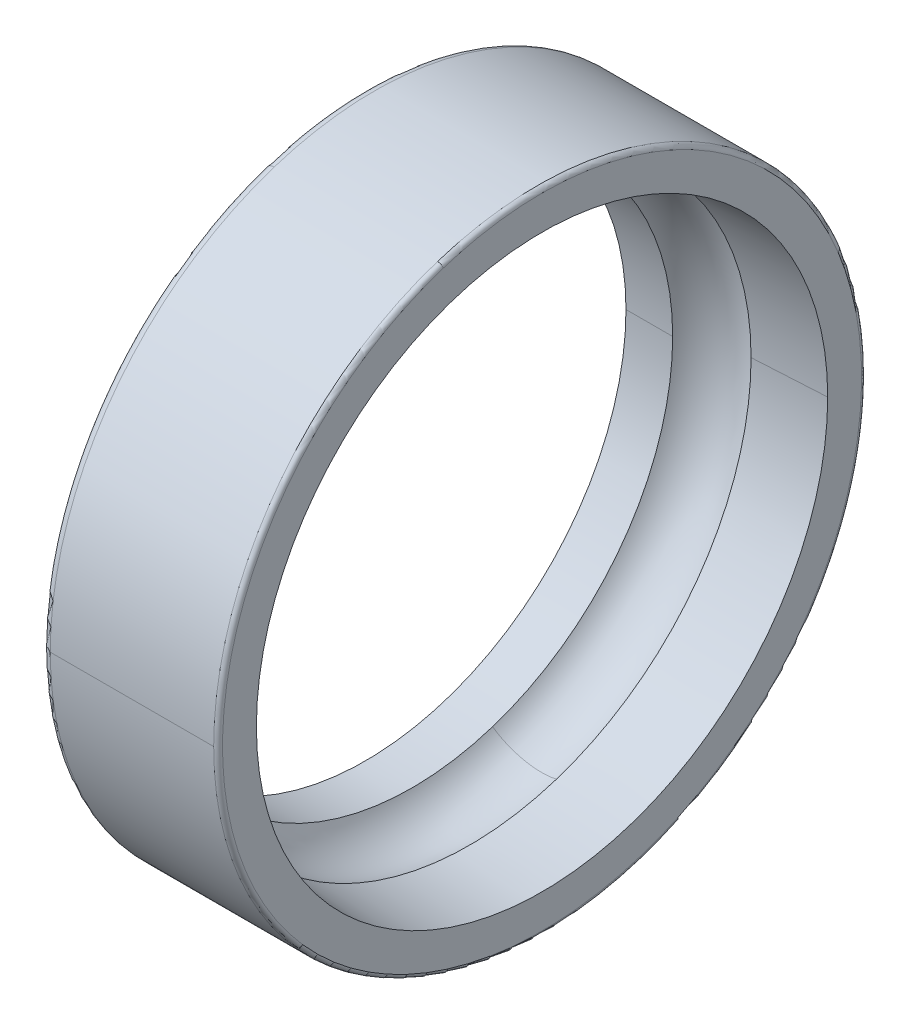
ISO-10303-21;
HEADER;
FILE_DESCRIPTION(('STEP AP214'),'2;1');
FILE_NAME('part.step','',(''),(''),'','','');
FILE_SCHEMA(('AUTOMOTIVE_DESIGN { 1 0 10303 214 1 1 1 1 }'));
ENDSEC;
DATA;
#1=APPLICATION_CONTEXT('core data for automotive mechanical design processes');
#2=APPLICATION_PROTOCOL_DEFINITION('international standard','automotive_design',2000,#1);
#3=PRODUCT_CONTEXT('',#1,'mechanical');
#4=PRODUCT('Part','Part','',(#3));
#5=PRODUCT_RELATED_PRODUCT_CATEGORY('part','',(#4));
#6=PRODUCT_DEFINITION_FORMATION('','',#4);
#7=PRODUCT_DEFINITION_CONTEXT('part definition',#1,'design');
#8=PRODUCT_DEFINITION('design','',#6,#7);
#9=PRODUCT_DEFINITION_SHAPE('','',#8);
#10=(LENGTH_UNIT() NAMED_UNIT(*) SI_UNIT(.MILLI.,.METRE.));
#11=(NAMED_UNIT(*) PLANE_ANGLE_UNIT() SI_UNIT($,.RADIAN.));
#12=(NAMED_UNIT(*) SI_UNIT($,.STERADIAN.) SOLID_ANGLE_UNIT());
#13=UNCERTAINTY_MEASURE_WITH_UNIT(LENGTH_MEASURE(1.E-05),#10,'distance_accuracy_value','');
#14=(GEOMETRIC_REPRESENTATION_CONTEXT(3) GLOBAL_UNCERTAINTY_ASSIGNED_CONTEXT((#13)) GLOBAL_UNIT_ASSIGNED_CONTEXT((#10,
#11,#12)) REPRESENTATION_CONTEXT('',''));
#15=CARTESIAN_POINT('',(0.,0.,0.));
#16=DIRECTION('',(0.,0.,1.));
#17=DIRECTION('',(1.,0.,0.));
#18=AXIS2_PLACEMENT_3D('',#15,#16,#17);
#19=CARTESIAN_POINT('',(0.,10.7,0.));
#20=DIRECTION('',(-1.,0.,0.));
#21=DIRECTION('',(0.,0.,1.));
#22=AXIS2_PLACEMENT_3D('',#19,#20,#21);
#23=PLANE('',#22);
#24=CARTESIAN_POINT('',(0.,0.,0.));
#25=DIRECTION('',(1.,0.,0.));
#26=DIRECTION('',(0.,0.,-1.));
#27=AXIS2_PLACEMENT_3D('',#24,#25,#26);
#28=CIRCLE('',#27,8.85);
#29=CARTESIAN_POINT('',(0.,0.,-8.85));
#30=VERTEX_POINT('',#29);
#31=CARTESIAN_POINT('',(0.,0.,8.85));
#32=VERTEX_POINT('',#31);
#33=EDGE_CURVE('E11',#30,#32,#28,.T.);
#34=ORIENTED_EDGE('',*,*,#33,.T.);
#35=CARTESIAN_POINT('',(0.,0.,0.));
#36=DIRECTION('',(1.,0.,0.));
#37=DIRECTION('',(0.,0.,-1.));
#38=AXIS2_PLACEMENT_3D('',#35,#36,#37);
#39=CIRCLE('',#38,8.85);
#40=EDGE_CURVE('E26',#32,#30,#39,.T.);
#41=ORIENTED_EDGE('',*,*,#40,.T.);
#42=EDGE_LOOP('',(#34,#41));
#43=FACE_BOUND('',#42,.T.);
#44=CARTESIAN_POINT('',(0.,10.1763047243581,3.30648183981196));
#45=CARTESIAN_POINT('',(0.,10.1222060192153,3.4729925522832));
#46=CARTESIAN_POINT('',(0.,10.0640137178569,3.63817284244062));
#47=CARTESIAN_POINT('',(0.,9.93959737326859,3.96548044496034));
#48=CARTESIAN_POINT('',(0.,9.87337333003879,4.12760775732264));
#49=CARTESIAN_POINT('',(0.,9.73304895226789,4.44841727108463));
#50=CARTESIAN_POINT('',(0.,9.65894861772679,4.60709947248432));
#51=CARTESIAN_POINT('',(0.,9.5030512671633,4.92063690146475));
#52=CARTESIAN_POINT('',(0.,9.42125425114093,5.07549212904549));
#53=CARTESIAN_POINT('',(0.,9.2501603002169,5.38100243898939));
#54=CARTESIAN_POINT('',(0.,9.16086336531526,5.53165752135256));
#55=CARTESIAN_POINT('',(0.,8.97498477943333,5.82840462947298));
#56=CARTESIAN_POINT('',(0.,8.87840312845304,5.97449665523024));
#57=CARTESIAN_POINT('',(0.,8.67818776299292,6.26176569364071));
#58=CARTESIAN_POINT('',(0.,8.57455404851308,6.40294270629393));
#59=CARTESIAN_POINT('',(0.,8.36048422439702,6.68004161285399));
#60=CARTESIAN_POINT('',(0.,8.25004811476079,6.81596350676083));
#61=CARTESIAN_POINT('',(0.,8.02263954907983,7.08222472750514));
#62=CARTESIAN_POINT('',(0.,7.90566709303509,7.2125640543426));
#63=CARTESIAN_POINT('',(0.,7.66546763183478,7.46734614224756));
#64=CARTESIAN_POINT('',(0.,7.5422406266792,7.59178890331505));
#65=CARTESIAN_POINT('',(0.,7.28982893179738,7.83447806612745));
#66=CARTESIAN_POINT('',(0.,7.16064424207114,7.95272446787235));
#67=CARTESIAN_POINT('',(0.,6.89662839530991,8.18273604611169));
#68=CARTESIAN_POINT('',(0.,6.76179723827492,8.29450122260611));
#69=CARTESIAN_POINT('',(0.,6.48681327695549,8.51128109824186));
#70=CARTESIAN_POINT('',(0.,6.34666047267106,8.61629579738319));
#71=CARTESIAN_POINT('',(0.,6.0613708572363,8.81932172870511));
#72=CARTESIAN_POINT('',(0.,5.91623404608597,8.91733296088571));
#73=CARTESIAN_POINT('',(0.,5.6213260642094,9.10611584064285));
#74=CARTESIAN_POINT('',(0.,5.47155489348316,9.19688748821941));
#75=CARTESIAN_POINT('',(0.,5.1677390043236,9.37097252191886));
#76=CARTESIAN_POINT('',(0.,5.01369428589029,9.45428590804176));
#77=CARTESIAN_POINT('',(0.,4.70170240853597,9.61325370958933));
#78=CARTESIAN_POINT('',(0.,4.54375524961497,9.688908125014));
#79=CARTESIAN_POINT('',(0.,4.22433899982567,9.83237572705182));
#80=CARTESIAN_POINT('',(0.,4.06286990895737,9.90018891366497));
#81=CARTESIAN_POINT('',(0.,3.73679878845639,10.0278106901734));
#82=CARTESIAN_POINT('',(0.,3.57219675882372,10.0876192800688));
#83=CARTESIAN_POINT('',(0.,3.24025630150081,10.19908777901));
#84=CARTESIAN_POINT('',(0.,3.07291787381057,10.2507476880558));
#85=CARTESIAN_POINT('',(0.,2.73590775330198,10.3457943720523));
#86=CARTESIAN_POINT('',(0.,2.56623606048361,10.3891811470029));
#87=CARTESIAN_POINT('',(0.,2.22496816368822,10.4675770402677));
#88=CARTESIAN_POINT('',(0.,2.0533719597112,10.502586158582));
#89=CARTESIAN_POINT('',(0.,1.70866843088395,10.5641423985417));
#90=CARTESIAN_POINT('',(0.,1.53556110603371,10.5906895201872));
#91=CARTESIAN_POINT('',(0.,1.18825236616799,10.635257812468));
#92=CARTESIAN_POINT('',(0.,1.01405095115252,10.6532789831034));
#93=CARTESIAN_POINT('',(0.,0.664973697423329,10.6807519587855));
#94=CARTESIAN_POINT('',(0.,0.490097858709621,10.6902037638323));
#95=CARTESIAN_POINT('',(0.,0.140093048796752,10.700515238111));
#96=CARTESIAN_POINT('',(0.,-0.0350359224024079,10.7013749073429));
#97=CARTESIAN_POINT('',(0.,-0.385125096255075,10.6945000389733));
#98=CARTESIAN_POINT('',(0.,-0.560085298908583,10.6867655013719));
#99=CARTESIAN_POINT('',(0.,-0.909415441217051,10.6627208525142));
#100=CARTESIAN_POINT('',(0.,-1.08378538087201,10.646410741258));
#101=CARTESIAN_POINT('',(0.,-1.43151492472575,10.6052542375774));
#102=CARTESIAN_POINT('',(0.,-1.60487452892453,10.580407845153));
#103=CARTESIAN_POINT('',(0.,-1.95016576339489,10.5222386362717));
#104=CARTESIAN_POINT('',(0.,-2.12209739366647,10.4889158198147));
#105=CARTESIAN_POINT('',(0.,-2.46411848192566,10.4138740404519));
#106=CARTESIAN_POINT('',(0.,-2.63420793991328,10.372155077546));
#107=CARTESIAN_POINT('',(0.,-2.97213492320218,10.2804215099211));
#108=CARTESIAN_POINT('',(0.,-3.13997244850347,10.230406905202));
#109=CARTESIAN_POINT('',(0.,-3.47299123112044,10.1222025435143));
#110=CARTESIAN_POINT('',(0.,-3.63817248843612,10.0640127865456));
#111=CARTESIAN_POINT('',(0.,-3.96548079896482,9.93959830457988));
#112=CARTESIAN_POINT('',(0.,-4.12760785217784,9.87337357958291));
#113=CARTESIAN_POINT('',(0.,-4.4484171762294,9.73304870272379));
#114=CARTESIAN_POINT('',(0.,-4.60709944706793,9.65894855086165));
#115=CARTESIAN_POINT('',(0.,-4.92063692688112,9.50305133402845));
#116=CARTESIAN_POINT('',(0.,-5.07549213585578,9.42125426905739));
#117=CARTESIAN_POINT('',(0.,-5.38100243217909,9.25016028230045));
#118=CARTESIAN_POINT('',(0.,-5.53165751952774,9.16086336051456));
#119=CARTESIAN_POINT('',(0.,-5.82840463129779,8.97498478423404));
#120=CARTESIAN_POINT('',(0.,-5.97449665571919,8.87840312973939));
#121=CARTESIAN_POINT('',(0.,-6.26176569315174,8.67818776170658));
#122=CARTESIAN_POINT('',(0.,-6.4029427061629,8.57455404816841));
#123=CARTESIAN_POINT('',(0.,-6.68004161298499,8.3604842247417));
#124=CARTESIAN_POINT('',(0.,-6.81596350679593,8.25004811485316));
#125=CARTESIAN_POINT('',(0.,-7.08222472747002,8.02263954898748));
#126=CARTESIAN_POINT('',(0.,-7.21256405433319,7.90566709301036));
#127=CARTESIAN_POINT('',(0.,-7.46734614225696,7.66546763185953));
#128=CARTESIAN_POINT('',(0.,-7.59178890331756,7.54224062668583));
#129=CARTESIAN_POINT('',(0.,-7.83447806612492,7.28982893179075));
#130=CARTESIAN_POINT('',(0.,-7.95272446787167,7.16064424206937));
#131=CARTESIAN_POINT('',(0.,-8.18273604611236,6.89662839531169));
#132=CARTESIAN_POINT('',(0.,-8.29450122260629,6.7617972382754));
#133=CARTESIAN_POINT('',(0.,-8.51128109824167,6.48681327695502));
#134=CARTESIAN_POINT('',(0.,-8.61629579738313,6.34666047267094));
#135=CARTESIAN_POINT('',(0.,-8.81932172870515,6.06137085723643));
#136=CARTESIAN_POINT('',(0.,-8.91733296088571,5.91623404608601));
#137=CARTESIAN_POINT('',(0.,-9.10611584064283,5.62132606420938));
#138=CARTESIAN_POINT('',(0.,-9.1968874882194,5.47155489348316));
#139=CARTESIAN_POINT('',(0.,-9.37097252191886,5.16773900432363));
#140=CARTESIAN_POINT('',(0.,-9.45428590804176,5.0136942858903));
#141=CARTESIAN_POINT('',(0.,-9.61325370958932,4.70170240853598));
#142=CARTESIAN_POINT('',(0.,-9.68890812501399,4.54375524961498));
#143=CARTESIAN_POINT('',(0.,-9.83237572705183,4.22433899982568));
#144=CARTESIAN_POINT('',(0.,-9.900188913665,4.06286990895737));
#145=CARTESIAN_POINT('',(0.,-10.0278106901734,3.73679878845641));
#146=CARTESIAN_POINT('',(0.,-10.0876192800686,3.57219675882376));
#147=CARTESIAN_POINT('',(0.,-10.1990877790101,3.24025630150078));
#148=CARTESIAN_POINT('',(0.,-10.2507476880563,3.07291787381045));
#149=CARTESIAN_POINT('',(0.,-10.3457943720518,2.73590775330212));
#150=CARTESIAN_POINT('',(0.,-10.389181147001,2.56623606048412));
#151=CARTESIAN_POINT('',(0.,-10.4675770402695,2.22496816368773));
#152=CARTESIAN_POINT('',(0.,-10.5025861585888,2.05337195970936));
#153=CARTESIAN_POINT('',(0.,-10.5641423985349,1.70866843088582));
#154=CARTESIAN_POINT('',(0.,-10.5906895201616,1.53556110604065));
#155=CARTESIAN_POINT('',(0.,-10.6352578124936,1.18825236616106));
#156=CARTESIAN_POINT('',(0.,-10.6532789831988,1.01405095112664));
#157=CARTESIAN_POINT('',(0.,-10.6807519586902,0.66497369744922));
#158=CARTESIAN_POINT('',(0.,-10.6902037634764,0.49009785880623));
#159=CARTESIAN_POINT('',(0.,-10.7005152384668,0.140093048700162));
#160=CARTESIAN_POINT('',(0.,-10.7013749086709,-0.0350359227629166));
#161=CARTESIAN_POINT('',(0.,-10.6945000376453,-0.385125095894546));
#162=CARTESIAN_POINT('',(0.,-10.6867654964154,-0.560085297563097));
#163=CARTESIAN_POINT('',(0.,-10.6627208574707,-0.909415442562518));
#164=CARTESIAN_POINT('',(0.,-10.6464107597557,-1.08378538589339));
#165=CARTESIAN_POINT('',(0.,-10.6052542190797,-1.43151491970436));
#166=CARTESIAN_POINT('',(0.,-10.5804077761186,-1.60487451018446));
#167=CARTESIAN_POINT('',(0.,-10.5222387053061,-1.95016578213494));
#168=CARTESIAN_POINT('',(0.,-10.4889160774547,-2.12209746360532));
#169=CARTESIAN_POINT('',(0.,-10.413873782812,-2.46411841198679));
#170=CARTESIAN_POINT('',(0.,-10.3721541160207,-2.63420767889787));
#171=CARTESIAN_POINT('',(0.,-10.2804224714464,-2.97213518421757));
#172=CARTESIAN_POINT('',(0.,-10.2304104936632,-3.13997342262617));
#173=CARTESIAN_POINT('',(0.,-10.1763047243581,-3.30648183981194));
#174=B_SPLINE_CURVE_WITH_KNOTS('',3,(#44,#45,#46,#47,#48,#49,#50,#51,#52,#53,#54,#55,#56,#57,
#58,#59,#60,#61,#62,#63,#64,#65,#66,#67,#68,#69,#70,#71,#72,#73,#74,#75,#76,#77,#78,#79,#80,#81,
#82,#83,#84,#85,#86,#87,#88,#89,#90,#91,#92,#93,#94,#95,#96,#97,#98,#99,#100,#101,#102,#103,
#104,#105,#106,#107,#108,#109,#110,#111,#112,#113,#114,#115,#116,#117,#118,#119,#120,#121,#122,
#123,#124,#125,#126,#127,#128,#129,#130,#131,#132,#133,#134,#135,#136,#137,#138,#139,#140,#141,
#142,#143,#144,#145,#146,#147,#148,#149,#150,#151,#152,#153,#154,#155,#156,#157,#158,#159,#160,
#161,#162,#163,#164,#165,#166,#167,#168,#169,#170,#171,#172,#173),.UNSPECIFIED.,.F.,.F.,(4,2,2,
2,2,2,2,2,2,2,2,2,2,2,2,2,2,2,2,2,2,2,2,2,2,2,2,2,2,2,2,2,2,2,2,2,2,2,2,2,2,2,2,2,2,2,2,2,2,2,2,
2,2,2,2,2,2,2,2,2,2,2,2,2,4),(0.,0.52518229039032,1.05036458078064,1.57554687117097,
2.10072916156129,2.62591145195161,3.15109374234194,3.67627603273226,4.20145832312258,
4.7266406135129,5.25182290390323,5.77700519429355,6.30218748468387,6.82736977507419,
7.35255206546451,7.87773435585484,8.40291664624516,8.92809893663548,9.4532812270258,
9.97846351741613,10.5036458078064,11.0288280981968,11.5540103885871,12.0791926789774,
12.6043749693677,13.1295572597581,13.6547395501484,14.1799218405387,14.705104130929,
15.2302864213194,15.7554687117097,16.2806510021,16.8058332924903,17.3310155828806,
17.856197873271,18.3813801636613,18.9065624540516,19.4317447444419,19.9569270348323,
20.4821093252226,21.0072916156129,21.5324739060032,22.0576561963935,22.5828384867839,
23.1080207771742,23.6332030675645,24.1583853579548,24.6835676483452,25.2087499387355,
25.7339322291258,26.2591145195161,26.7842968099065,27.3094791002968,27.8346613906871,
28.3598436810774,28.8850259714678,29.4102082618581,29.9353905522484,30.4605728426387,
30.985755133029,31.5109374234194,32.0361197138097,32.5613020042,33.0864842945903,
33.6116665849807),.UNSPECIFIED.);
#175=CARTESIAN_POINT('',(0.,10.1763047243581,3.30648183981194));
#176=VERTEX_POINT('',#175);
#177=CARTESIAN_POINT('',(0.,-10.1763047243581,-3.30648183981193));
#178=VERTEX_POINT('',#177);
#179=EDGE_CURVE('E243',#176,#178,#174,.T.);
#180=ORIENTED_EDGE('',*,*,#179,.F.);
#181=CARTESIAN_POINT('',(0.,-10.1763047243581,-3.30648183981196));
#182=CARTESIAN_POINT('',(0.,-10.1222060192153,-3.4729925522832));
#183=CARTESIAN_POINT('',(0.,-10.0640137178569,-3.63817284244062));
#184=CARTESIAN_POINT('',(0.,-9.93959737326859,-3.96548044496034));
#185=CARTESIAN_POINT('',(0.,-9.87337333003879,-4.12760775732264));
#186=CARTESIAN_POINT('',(0.,-9.73304895226789,-4.44841727108463));
#187=CARTESIAN_POINT('',(0.,-9.65894861772679,-4.60709947248432));
#188=CARTESIAN_POINT('',(0.,-9.50305126716331,-4.92063690146475));
#189=CARTESIAN_POINT('',(0.,-9.42125425114093,-5.07549212904549));
#190=CARTESIAN_POINT('',(0.,-9.2501603002169,-5.38100243898939));
#191=CARTESIAN_POINT('',(0.,-9.16086336531526,-5.53165752135256));
#192=CARTESIAN_POINT('',(0.,-8.97498477943333,-5.82840462947298));
#193=CARTESIAN_POINT('',(0.,-8.87840312845305,-5.97449665523023));
#194=CARTESIAN_POINT('',(0.,-8.67818776299292,-6.2617656936407));
#195=CARTESIAN_POINT('',(0.,-8.57455404851308,-6.40294270629392));
#196=CARTESIAN_POINT('',(0.,-8.36048422439702,-6.68004161285398));
#197=CARTESIAN_POINT('',(0.,-8.2500481147608,-6.81596350676083));
#198=CARTESIAN_POINT('',(0.,-8.02263954907984,-7.08222472750514));
#199=CARTESIAN_POINT('',(0.,-7.9056670930351,-7.2125640543426));
#200=CARTESIAN_POINT('',(0.,-7.66546763183478,-7.46734614224755));
#201=CARTESIAN_POINT('',(0.,-7.5422406266792,-7.59178890331504));
#202=CARTESIAN_POINT('',(0.,-7.28982893179738,-7.83447806612744));
#203=CARTESIAN_POINT('',(0.,-7.16064424207114,-7.95272446787235));
#204=CARTESIAN_POINT('',(0.,-6.89662839530992,-8.18273604611168));
#205=CARTESIAN_POINT('',(0.,-6.76179723827492,-8.2945012226061));
#206=CARTESIAN_POINT('',(0.,-6.4868132769555,-8.51128109824185));
#207=CARTESIAN_POINT('',(0.,-6.34666047267107,-8.61629579738318));
#208=CARTESIAN_POINT('',(0.,-6.06137085723631,-8.81932172870511));
#209=CARTESIAN_POINT('',(0.,-5.91623404608598,-8.9173329608857));
#210=CARTESIAN_POINT('',(0.,-5.62132606420941,-9.10611584064285));
#211=CARTESIAN_POINT('',(0.,-5.47155489348317,-9.1968874882194));
#212=CARTESIAN_POINT('',(0.,-5.16773900432361,-9.37097252191885));
#213=CARTESIAN_POINT('',(0.,-5.0136942858903,-9.45428590804176));
#214=CARTESIAN_POINT('',(0.,-4.70170240853598,-9.61325370958933));
#215=CARTESIAN_POINT('',(0.,-4.54375524961498,-9.688908125014));
#216=CARTESIAN_POINT('',(0.,-4.22433899982568,-9.83237572705182));
#217=CARTESIAN_POINT('',(0.,-4.06286990895738,-9.90018891366496));
#218=CARTESIAN_POINT('',(0.,-3.7367987884564,-10.0278106901734));
#219=CARTESIAN_POINT('',(0.,-3.57219675882373,-10.0876192800688));
#220=CARTESIAN_POINT('',(0.,-3.24025630150082,-10.19908777901));
#221=CARTESIAN_POINT('',(0.,-3.07291787381059,-10.2507476880558));
#222=CARTESIAN_POINT('',(0.,-2.73590775330199,-10.3457943720523));
#223=CARTESIAN_POINT('',(0.,-2.56623606048362,-10.3891811470029));
#224=CARTESIAN_POINT('',(0.,-2.22496816368823,-10.4675770402677));
#225=CARTESIAN_POINT('',(0.,-2.05337195971121,-10.502586158582));
#226=CARTESIAN_POINT('',(0.,-1.70866843088396,-10.5641423985417));
#227=CARTESIAN_POINT('',(0.,-1.53556110603372,-10.5906895201872));
#228=CARTESIAN_POINT('',(0.,-1.18825236616801,-10.635257812468));
#229=CARTESIAN_POINT('',(0.,-1.01405095115253,-10.6532789831034));
#230=CARTESIAN_POINT('',(0.,-0.664973697423343,-10.6807519587855));
#231=CARTESIAN_POINT('',(0.,-0.490097858709633,-10.6902037638323));
#232=CARTESIAN_POINT('',(0.,-0.140093048796764,-10.700515238111));
#233=CARTESIAN_POINT('',(0.,0.035035922402394,-10.7013749073429));
#234=CARTESIAN_POINT('',(0.,0.38512509625506,-10.6945000389733));
#235=CARTESIAN_POINT('',(0.,0.560085298908567,-10.6867655013719));
#236=CARTESIAN_POINT('',(0.,0.909415441217034,-10.6627208525142));
#237=CARTESIAN_POINT('',(0.,1.08378538087199,-10.646410741258));
#238=CARTESIAN_POINT('',(0.,1.43151492472573,-10.6052542375774));
#239=CARTESIAN_POINT('',(0.,1.60487452892451,-10.580407845153));
#240=CARTESIAN_POINT('',(0.,1.95016576339487,-10.5222386362717));
#241=CARTESIAN_POINT('',(0.,2.12209739366645,-10.4889158198147));
#242=CARTESIAN_POINT('',(0.,2.46411848192564,-10.4138740404519));
#243=CARTESIAN_POINT('',(0.,2.63420793991326,-10.372155077546));
#244=CARTESIAN_POINT('',(0.,2.97213492320216,-10.2804215099211));
#245=CARTESIAN_POINT('',(0.,3.13997244850345,-10.230406905202));
#246=CARTESIAN_POINT('',(0.,3.47299123112042,-10.1222025435143));
#247=CARTESIAN_POINT('',(0.,3.6381724884361,-10.0640127865456));
#248=CARTESIAN_POINT('',(0.,3.9654807989648,-9.93959830457989));
#249=CARTESIAN_POINT('',(0.,4.12760785217782,-9.87337357958291));
#250=CARTESIAN_POINT('',(0.,4.44841717622938,-9.7330487027238));
#251=CARTESIAN_POINT('',(0.,4.60709944706791,-9.65894855086166));
#252=CARTESIAN_POINT('',(0.,4.9206369268811,-9.50305133402846));
#253=CARTESIAN_POINT('',(0.,5.07549213585576,-9.4212542690574));
#254=CARTESIAN_POINT('',(0.,5.38100243217907,-9.25016028230046));
#255=CARTESIAN_POINT('',(0.,5.53165751952772,-9.16086336051458));
#256=CARTESIAN_POINT('',(0.,5.82840463129777,-8.97498478423405));
#257=CARTESIAN_POINT('',(0.,5.97449665571916,-8.87840312973941));
#258=CARTESIAN_POINT('',(0.,6.26176569315172,-8.67818776170659));
#259=CARTESIAN_POINT('',(0.,6.40294270616288,-8.57455404816842));
#260=CARTESIAN_POINT('',(0.,6.68004161298497,-8.36048422474171));
#261=CARTESIAN_POINT('',(0.,6.81596350679591,-8.25004811485317));
#262=CARTESIAN_POINT('',(0.,7.08222472747001,-8.0226395489875));
#263=CARTESIAN_POINT('',(0.,7.21256405433317,-7.90566709301037));
#264=CARTESIAN_POINT('',(0.,7.46734614225694,-7.66546763185954));
#265=CARTESIAN_POINT('',(0.,7.59178890331754,-7.54224062668585));
#266=CARTESIAN_POINT('',(0.,7.8344780661249,-7.28982893179077));
#267=CARTESIAN_POINT('',(0.,7.95272446787165,-7.16064424206939));
#268=CARTESIAN_POINT('',(0.,8.18273604611234,-6.89662839531171));
#269=CARTESIAN_POINT('',(0.,8.29450122260627,-6.76179723827542));
#270=CARTESIAN_POINT('',(0.,8.51128109824166,-6.48681327695505));
#271=CARTESIAN_POINT('',(0.,8.61629579738312,-6.34666047267096));
#272=CARTESIAN_POINT('',(0.,8.81932172870514,-6.06137085723646));
#273=CARTESIAN_POINT('',(0.,8.9173329608857,-5.91623404608604));
#274=CARTESIAN_POINT('',(0.,9.10611584064282,-5.6213260642094));
#275=CARTESIAN_POINT('',(0.,9.19688748821938,-5.47155489348319));
#276=CARTESIAN_POINT('',(0.,9.37097252191884,-5.16773900432365));
#277=CARTESIAN_POINT('',(0.,9.45428590804174,-5.01369428589033));
#278=CARTESIAN_POINT('',(0.,9.61325370958931,-4.70170240853601));
#279=CARTESIAN_POINT('',(0.,9.68890812501398,-4.54375524961501));
#280=CARTESIAN_POINT('',(0.,9.83237572705182,-4.2243389998257));
#281=CARTESIAN_POINT('',(0.,9.90018891366499,-4.06286990895739));
#282=CARTESIAN_POINT('',(0.,10.0278106901734,-3.73679878845644));
#283=CARTESIAN_POINT('',(0.,10.0876192800686,-3.57219675882379));
#284=CARTESIAN_POINT('',(0.,10.1990877790101,-3.24025630150081));
#285=CARTESIAN_POINT('',(0.,10.2507476880563,-3.07291787381048));
#286=CARTESIAN_POINT('',(0.,10.3457943720518,-2.73590775330215));
#287=CARTESIAN_POINT('',(0.,10.389181147001,-2.56623606048414));
#288=CARTESIAN_POINT('',(0.,10.4675770402695,-2.22496816368776));
#289=CARTESIAN_POINT('',(0.,10.5025861585888,-2.05337195970938));
#290=CARTESIAN_POINT('',(0.,10.5641423985349,-1.70866843088585));
#291=CARTESIAN_POINT('',(0.,10.5906895201616,-1.53556110604069));
#292=CARTESIAN_POINT('',(0.,10.6352578124936,-1.1882523661611));
#293=CARTESIAN_POINT('',(0.,10.6532789831988,-1.01405095112668));
#294=CARTESIAN_POINT('',(0.,10.6807519586902,-0.66497369744926));
#295=CARTESIAN_POINT('',(0.,10.6902037634764,-0.490097858806269));
#296=CARTESIAN_POINT('',(0.,10.7005152384668,-0.140093048700201));
#297=CARTESIAN_POINT('',(0.,10.7013749086709,0.0350359227628772));
#298=CARTESIAN_POINT('',(0.,10.6945000376453,0.385125095894506));
#299=CARTESIAN_POINT('',(0.,10.6867654964154,0.560085297563057));
#300=CARTESIAN_POINT('',(0.,10.6627208574707,0.909415442562479));
#301=CARTESIAN_POINT('',(0.,10.6464107597557,1.08378538589335));
#302=CARTESIAN_POINT('',(0.,10.6052542190797,1.43151491970432));
#303=CARTESIAN_POINT('',(0.,10.5804077761186,1.60487451018442));
#304=CARTESIAN_POINT('',(0.,10.5222387053061,1.9501657821349));
#305=CARTESIAN_POINT('',(0.,10.4889160774547,2.12209746360528));
#306=CARTESIAN_POINT('',(0.,10.413873782812,2.46411841198675));
#307=CARTESIAN_POINT('',(0.,10.3721541160208,2.63420767889784));
#308=CARTESIAN_POINT('',(0.,10.2804224714464,2.97213518421753));
#309=CARTESIAN_POINT('',(0.,10.2304104936632,3.13997342262613));
#310=CARTESIAN_POINT('',(0.,10.1763047243582,3.30648183981191));
#311=B_SPLINE_CURVE_WITH_KNOTS('',3,(#181,#182,#183,#184,#185,#186,#187,#188,#189,#190,#191,
#192,#193,#194,#195,#196,#197,#198,#199,#200,#201,#202,#203,#204,#205,#206,#207,#208,#209,#210,
#211,#212,#213,#214,#215,#216,#217,#218,#219,#220,#221,#222,#223,#224,#225,#226,#227,#228,#229,
#230,#231,#232,#233,#234,#235,#236,#237,#238,#239,#240,#241,#242,#243,#244,#245,#246,#247,#248,
#249,#250,#251,#252,#253,#254,#255,#256,#257,#258,#259,#260,#261,#262,#263,#264,#265,#266,#267,
#268,#269,#270,#271,#272,#273,#274,#275,#276,#277,#278,#279,#280,#281,#282,#283,#284,#285,#286,
#287,#288,#289,#290,#291,#292,#293,#294,#295,#296,#297,#298,#299,#300,#301,#302,#303,#304,#305,
#306,#307,#308,#309,#310),.UNSPECIFIED.,.F.,.F.,(4,2,2,2,2,2,2,2,2,2,2,2,2,2,2,2,2,2,2,2,2,2,2,
2,2,2,2,2,2,2,2,2,2,2,2,2,2,2,2,2,2,2,2,2,2,2,2,2,2,2,2,2,2,2,2,2,2,2,2,2,2,2,2,2,4),(0.,
0.52518229039032,1.05036458078064,1.57554687117097,2.10072916156129,2.62591145195161,
3.15109374234193,3.67627603273225,4.20145832312258,4.7266406135129,5.25182290390322,
5.77700519429354,6.30218748468386,6.82736977507418,7.35255206546451,7.87773435585483,
8.40291664624515,8.92809893663547,9.4532812270258,9.97846351741612,10.5036458078064,
11.0288280981968,11.5540103885871,12.0791926789774,12.6043749693677,13.1295572597581,
13.6547395501484,14.1799218405387,14.705104130929,15.2302864213193,15.7554687117097,
16.2806510021,16.8058332924903,17.3310155828806,17.856197873271,18.3813801636613,
18.9065624540516,19.4317447444419,19.9569270348322,20.4821093252226,21.0072916156129,
21.5324739060032,22.0576561963935,22.5828384867838,23.1080207771742,23.6332030675645,
24.1583853579548,24.6835676483451,25.2087499387355,25.7339322291258,26.2591145195161,
26.7842968099064,27.3094791002968,27.8346613906871,28.3598436810774,28.8850259714677,
29.410208261858,29.9353905522484,30.4605728426387,30.985755133029,31.5109374234193,
32.0361197138097,32.5613020042,33.0864842945903,33.6116665849806),.UNSPECIFIED.);
#312=EDGE_CURVE('E344',#178,#176,#311,.T.);
#313=ORIENTED_EDGE('',*,*,#312,.F.);
#314=EDGE_LOOP('',(#180,#313));
#315=FACE_BOUND('',#314,.T.);
#316=ADVANCED_FACE('F17',(#43,#315),#23,.T.);
#317=CARTESIAN_POINT('',(0.299999999999936,0.,0.));
#318=DIRECTION('',(1.,0.,0.));
#319=DIRECTION('',(0.,-0.309016994374947,0.951056516295154));
#320=AXIS2_PLACEMENT_3D('',#317,#318,#319);
#321=TOROIDAL_SURFACE('',#320,10.7,0.299999999999936);
#322=CARTESIAN_POINT('',(0.299999999999936,-10.1763047243581,-3.30648183981193));
#323=DIRECTION('',(0.,0.309016994374948,-0.951056516295154));
#324=DIRECTION('',(2.11682523361907E-13,-0.951056516295154,-0.309016994374948));
#325=AXIS2_PLACEMENT_3D('',#322,#323,#324);
#326=CIRCLE('',#325,0.299999999999937);
#327=CARTESIAN_POINT('',(0.3,-10.4616216792466,-3.3991869381244));
#328=VERTEX_POINT('',#327);
#329=EDGE_CURVE('E307',#328,#178,#326,.T.);
#330=ORIENTED_EDGE('',*,*,#329,.T.);
#331=ORIENTED_EDGE('',*,*,#312,.T.);
#332=CARTESIAN_POINT('',(0.299999999999936,10.1763047243581,3.30648183981194));
#333=DIRECTION('',(0.,-0.309016994374948,0.951056516295154));
#334=DIRECTION('',(2.11682523361907E-13,0.951056516295154,0.309016994374948));
#335=AXIS2_PLACEMENT_3D('',#332,#333,#334);
#336=CIRCLE('',#335,0.299999999999937);
#337=CARTESIAN_POINT('',(0.3,10.4616216792466,3.3991869381244));
#338=VERTEX_POINT('',#337);
#339=EDGE_CURVE('E303',#338,#176,#336,.T.);
#340=ORIENTED_EDGE('',*,*,#339,.F.);
#341=CARTESIAN_POINT('',(0.3,0.,0.));
#342=DIRECTION('',(1.,0.,0.));
#343=DIRECTION('',(0.,0.,-1.));
#344=AXIS2_PLACEMENT_3D('',#341,#342,#343);
#345=CIRCLE('',#344,11.);
#346=CARTESIAN_POINT('',(0.3,0.,-11.));
#347=VERTEX_POINT('',#346);
#348=EDGE_CURVE('E298',#347,#338,#345,.T.);
#349=ORIENTED_EDGE('',*,*,#348,.F.);
#350=CARTESIAN_POINT('',(0.3,0.,0.));
#351=DIRECTION('',(1.,0.,0.));
#352=DIRECTION('',(0.,0.,-1.));
#353=AXIS2_PLACEMENT_3D('',#350,#351,#352);
#354=CIRCLE('',#353,11.);
#355=EDGE_CURVE('E293',#328,#347,#354,.T.);
#356=ORIENTED_EDGE('',*,*,#355,.F.);
#357=EDGE_LOOP('',(#330,#331,#340,#349,#356));
#358=FACE_BOUND('',#357,.T.);
#359=ADVANCED_FACE('F315',(#358),#321,.T.);
#360=CARTESIAN_POINT('',(6.,0.,0.));
#361=DIRECTION('',(1.,0.,0.));
#362=DIRECTION('',(0.,1.,0.));
#363=AXIS2_PLACEMENT_3D('',#360,#361,#362);
#364=CYLINDRICAL_SURFACE('',#363,11.);
#365=DIRECTION('',(1.,0.,0.));
#366=VECTOR('',#365,1.);
#367=CARTESIAN_POINT('',(0.3,0.,11.));
#368=LINE('',#367,#366);
#369=CARTESIAN_POINT('',(0.3,0.,11.));
#370=VERTEX_POINT('',#369);
#371=CARTESIAN_POINT('',(5.85,0.,11.));
#372=VERTEX_POINT('',#371);
#373=EDGE_CURVE('E288',#370,#372,#368,.T.);
#374=ORIENTED_EDGE('',*,*,#373,.F.);
#375=CARTESIAN_POINT('',(0.3,0.,0.));
#376=DIRECTION('',(1.,0.,0.));
#377=DIRECTION('',(0.,0.,-1.));
#378=AXIS2_PLACEMENT_3D('',#375,#376,#377);
#379=CIRCLE('',#378,11.);
#380=EDGE_CURVE('E283',#370,#328,#379,.T.);
#381=ORIENTED_EDGE('',*,*,#380,.T.);
#382=ORIENTED_EDGE('',*,*,#355,.T.);
#383=DIRECTION('',(1.,0.,0.));
#384=VECTOR('',#383,1.);
#385=CARTESIAN_POINT('',(0.300000000000002,0.,-11.));
#386=LINE('',#385,#384);
#387=CARTESIAN_POINT('',(5.85,0.,-11.));
#388=VERTEX_POINT('',#387);
#389=EDGE_CURVE('E279',#347,#388,#386,.T.);
#390=ORIENTED_EDGE('',*,*,#389,.T.);
#391=CARTESIAN_POINT('',(5.85,0.,0.));
#392=DIRECTION('',(1.,0.,0.));
#393=DIRECTION('',(0.,0.,-1.));
#394=AXIS2_PLACEMENT_3D('',#391,#392,#393);
#395=CIRCLE('',#394,11.);
#396=CARTESIAN_POINT('',(5.85,-10.4616216792466,-3.3991869381244));
#397=VERTEX_POINT('',#396);
#398=EDGE_CURVE('E274',#397,#388,#395,.T.);
#399=ORIENTED_EDGE('',*,*,#398,.F.);
#400=CARTESIAN_POINT('',(5.85,0.,0.));
#401=DIRECTION('',(1.,0.,0.));
#402=DIRECTION('',(0.,0.,-1.));
#403=AXIS2_PLACEMENT_3D('',#400,#401,#402);
#404=CIRCLE('',#403,11.);
#405=EDGE_CURVE('E269',#372,#397,#404,.T.);
#406=ORIENTED_EDGE('',*,*,#405,.F.);
#407=EDGE_LOOP('',(#374,#381,#382,#390,#399,#406));
#408=FACE_BOUND('',#407,.T.);
#409=ADVANCED_FACE('F324',(#408),#364,.T.);
#410=CARTESIAN_POINT('',(5.85,0.,0.));
#411=DIRECTION('',(1.,0.,0.));
#412=DIRECTION('',(0.,0.309016994374947,-0.951056516295154));
#413=AXIS2_PLACEMENT_3D('',#410,#411,#412);
#414=TOROIDAL_SURFACE('',#413,10.85,0.149999999999938);
#415=CARTESIAN_POINT('',(5.85,-10.3189632018024,-3.35283438896818));
#416=DIRECTION('',(0.,0.309016994374947,-0.951056516295154));
#417=DIRECTION('',(1.,0.,0.));
#418=AXIS2_PLACEMENT_3D('',#415,#416,#417);
#419=CIRCLE('',#418,0.149999999999938);
#420=CARTESIAN_POINT('',(5.99999999999994,-10.3189632018024,-3.35283438896818));
#421=VERTEX_POINT('',#420);
#422=EDGE_CURVE('E265',#421,#397,#419,.T.);
#423=ORIENTED_EDGE('',*,*,#422,.F.);
#424=CARTESIAN_POINT('',(6.,0.,0.));
#425=DIRECTION('',(1.,0.,0.));
#426=DIRECTION('',(0.,0.,-1.));
#427=AXIS2_PLACEMENT_3D('',#424,#425,#426);
#428=CIRCLE('',#427,10.85);
#429=CARTESIAN_POINT('',(5.99999999999994,10.3189632018024,3.35283438896818));
#430=VERTEX_POINT('',#429);
#431=EDGE_CURVE('E261',#430,#421,#428,.T.);
#432=ORIENTED_EDGE('',*,*,#431,.F.);
#433=CARTESIAN_POINT('',(5.85,10.3189632018024,3.35283438896818));
#434=DIRECTION('',(0.,-0.309016994374947,0.951056516295154));
#435=DIRECTION('',(1.,0.,0.));
#436=AXIS2_PLACEMENT_3D('',#433,#434,#435);
#437=CIRCLE('',#436,0.149999999999938);
#438=CARTESIAN_POINT('',(5.85,10.4616216792466,3.3991869381244));
#439=VERTEX_POINT('',#438);
#440=EDGE_CURVE('E257',#430,#439,#437,.T.);
#441=ORIENTED_EDGE('',*,*,#440,.T.);
#442=CARTESIAN_POINT('',(5.85,0.,0.));
#443=DIRECTION('',(1.,0.,0.));
#444=DIRECTION('',(0.,0.,-1.));
#445=AXIS2_PLACEMENT_3D('',#442,#443,#444);
#446=CIRCLE('',#445,11.);
#447=EDGE_CURVE('E252',#439,#372,#446,.T.);
#448=ORIENTED_EDGE('',*,*,#447,.T.);
#449=ORIENTED_EDGE('',*,*,#405,.T.);
#450=EDGE_LOOP('',(#423,#432,#441,#448,#449));
#451=FACE_BOUND('',#450,.T.);
#452=ADVANCED_FACE('F328',(#451),#414,.T.);
#453=CARTESIAN_POINT('',(6.,0.,0.));
#454=DIRECTION('',(1.,0.,0.));
#455=DIRECTION('',(0.,-1.,0.));
#456=AXIS2_PLACEMENT_3D('',#453,#454,#455);
#457=CYLINDRICAL_SURFACE('',#456,11.);
#458=ORIENTED_EDGE('',*,*,#373,.T.);
#459=ORIENTED_EDGE('',*,*,#447,.F.);
#460=CARTESIAN_POINT('',(5.85,0.,0.));
#461=DIRECTION('',(1.,0.,0.));
#462=DIRECTION('',(0.,0.,-1.));
#463=AXIS2_PLACEMENT_3D('',#460,#461,#462);
#464=CIRCLE('',#463,11.);
#465=EDGE_CURVE('E247',#388,#439,#464,.T.);
#466=ORIENTED_EDGE('',*,*,#465,.F.);
#467=ORIENTED_EDGE('',*,*,#389,.F.);
#468=ORIENTED_EDGE('',*,*,#348,.T.);
#469=CARTESIAN_POINT('',(0.3,0.,0.));
#470=DIRECTION('',(1.,0.,0.));
#471=DIRECTION('',(0.,0.,-1.));
#472=AXIS2_PLACEMENT_3D('',#469,#470,#471);
#473=CIRCLE('',#472,11.);
#474=EDGE_CURVE('E244',#338,#370,#473,.T.);
#475=ORIENTED_EDGE('',*,*,#474,.T.);
#476=EDGE_LOOP('',(#458,#459,#466,#467,#468,#475));
#477=FACE_BOUND('',#476,.T.);
#478=ADVANCED_FACE('F331',(#477),#457,.T.);
#479=CARTESIAN_POINT('',(0.299999999999936,0.,0.));
#480=DIRECTION('',(1.,0.,0.));
#481=DIRECTION('',(0.,0.309016994374947,-0.951056516295154));
#482=AXIS2_PLACEMENT_3D('',#479,#480,#481);
#483=TOROIDAL_SURFACE('',#482,10.7,0.299999999999936);
#484=ORIENTED_EDGE('',*,*,#329,.F.);
#485=ORIENTED_EDGE('',*,*,#380,.F.);
#486=ORIENTED_EDGE('',*,*,#474,.F.);
#487=ORIENTED_EDGE('',*,*,#339,.T.);
#488=ORIENTED_EDGE('',*,*,#179,.T.);
#489=EDGE_LOOP('',(#484,#485,#486,#487,#488));
#490=FACE_BOUND('',#489,.T.);
#491=ADVANCED_FACE('F213',(#490),#483,.T.);
#492=CARTESIAN_POINT('',(5.85,0.,0.));
#493=DIRECTION('',(1.,0.,0.));
#494=DIRECTION('',(0.,-0.309016994374947,0.951056516295154));
#495=AXIS2_PLACEMENT_3D('',#492,#493,#494);
#496=TOROIDAL_SURFACE('',#495,10.85,0.149999999999938);
#497=ORIENTED_EDGE('',*,*,#422,.T.);
#498=ORIENTED_EDGE('',*,*,#398,.T.);
#499=ORIENTED_EDGE('',*,*,#465,.T.);
#500=ORIENTED_EDGE('',*,*,#440,.F.);
#501=CARTESIAN_POINT('',(6.,-10.3189632018024,-3.35283438896818));
#502=CARTESIAN_POINT('',(6.,-9.79227981656871,-4.97371817204921));
#503=CARTESIAN_POINT('',(6.,-8.94746772798863,-6.49128621292151));
#504=CARTESIAN_POINT('',(6.,-7.81102239824039,-7.82182102544327));
#505=CARTESIAN_POINT('',(6.,-5.07769101024995,-9.96552591836774));
#506=CARTESIAN_POINT('',(6.,-1.73678326995609,-10.9168102875964));
#507=CARTESIAN_POINT('',(6.,0.00763619954718096,-11.0541020519545));
#508=CARTESIAN_POINT('',(6.,3.4562205040284,-10.6371529460958));
#509=CARTESIAN_POINT('',(6.,6.49126034826872,-8.94744486306357));
#510=CARTESIAN_POINT('',(6.,7.82182727006447,-7.81102945452428));
#511=CARTESIAN_POINT('',(6.,9.96552748563207,-5.07768793432052));
#512=CARTESIAN_POINT('',(6.,10.9168009084465,-1.73678236553102));
#513=CARTESIAN_POINT('',(6.,11.054135752929,0.00762871426927791));
#514=CARTESIAN_POINT('',(6.,10.8455989758685,1.73193513608102));
#515=CARTESIAN_POINT('',(6.,10.3189632018024,3.35283438896818));
#516=B_SPLINE_CURVE_WITH_KNOTS('',5,(#501,#502,#503,#504,#505,#506,#507,#508,#509,#510,#511,
#512,#513,#514,#515),.UNSPECIFIED.,.F.,.F.,(6,3,3,3,6),(0.,0.785398163397448,1.5707963267949,
2.35619449019234,3.14159265358979),.UNSPECIFIED.);
#517=EDGE_CURVE('E187',#421,#430,#516,.T.);
#518=ORIENTED_EDGE('',*,*,#517,.F.);
#519=EDGE_LOOP('',(#497,#498,#499,#500,#518));
#520=FACE_BOUND('',#519,.T.);
#521=ADVANCED_FACE('F207',(#520),#496,.T.);
#522=CARTESIAN_POINT('',(6.,9.7,0.));
#523=DIRECTION('',(1.,0.,0.));
#524=DIRECTION('',(0.,0.,-1.));
#525=AXIS2_PLACEMENT_3D('',#522,#523,#524);
#526=PLANE('',#525);
#527=ORIENTED_EDGE('',*,*,#431,.T.);
#528=ORIENTED_EDGE('',*,*,#517,.T.);
#529=EDGE_LOOP('',(#527,#528));
#530=FACE_BOUND('',#529,.T.);
#531=CARTESIAN_POINT('',(6.,0.,0.));
#532=DIRECTION('',(1.,0.,0.));
#533=DIRECTION('',(0.,0.,-1.));
#534=AXIS2_PLACEMENT_3D('',#531,#532,#533);
#535=CIRCLE('',#534,9.7);
#536=CARTESIAN_POINT('',(6.00000000000003,0.,9.7));
#537=VERTEX_POINT('',#536);
#538=CARTESIAN_POINT('',(6.,0.,-9.7));
#539=VERTEX_POINT('',#538);
#540=EDGE_CURVE('E182',#537,#539,#535,.T.);
#541=ORIENTED_EDGE('',*,*,#540,.F.);
#542=CARTESIAN_POINT('',(6.,0.,0.));
#543=DIRECTION('',(1.,0.,0.));
#544=DIRECTION('',(0.,0.,-1.));
#545=AXIS2_PLACEMENT_3D('',#542,#543,#544);
#546=CIRCLE('',#545,9.7);
#547=EDGE_CURVE('E177',#539,#537,#546,.T.);
#548=ORIENTED_EDGE('',*,*,#547,.F.);
#549=EDGE_LOOP('',(#541,#548));
#550=FACE_BOUND('',#549,.T.);
#551=ADVANCED_FACE('F196',(#530,#550),#526,.T.);
#552=CARTESIAN_POINT('',(3.5374941860151,0.,0.));
#553=DIRECTION('',(1.,0.,0.));
#554=DIRECTION('',(0.,-1.,0.));
#555=AXIS2_PLACEMENT_3D('',#552,#553,#554);
#556=CONICAL_SURFACE('',#555,9.56,0.0567915226449564);
#557=DIRECTION('',(0.998387794865072,0.,0.0567609995019349));
#558=VECTOR('',#557,1.);
#559=CARTESIAN_POINT('',(3.53749418601513,0.,9.56));
#560=LINE('',#559,#558);
#561=CARTESIAN_POINT('',(3.53749418601513,0.,9.56));
#562=VERTEX_POINT('',#561);
#563=EDGE_CURVE('E172',#562,#537,#560,.T.);
#564=ORIENTED_EDGE('',*,*,#563,.F.);
#565=CARTESIAN_POINT('',(3.5374941860151,0.,0.));
#566=DIRECTION('',(1.,0.,0.));
#567=DIRECTION('',(0.,0.,-1.));
#568=AXIS2_PLACEMENT_3D('',#565,#566,#567);
#569=CIRCLE('',#568,9.56);
#570=CARTESIAN_POINT('',(3.53749418601512,9.09210029578171,2.95420246622451));
#571=VERTEX_POINT('',#570);
#572=EDGE_CURVE('E167',#571,#562,#569,.T.);
#573=ORIENTED_EDGE('',*,*,#572,.F.);
#574=CARTESIAN_POINT('',(3.5374941860151,0.,0.));
#575=DIRECTION('',(1.,0.,0.));
#576=DIRECTION('',(0.,0.,-1.));
#577=AXIS2_PLACEMENT_3D('',#574,#575,#576);
#578=CIRCLE('',#577,9.56);
#579=CARTESIAN_POINT('',(3.5374941860151,0.,-9.56));
#580=VERTEX_POINT('',#579);
#581=EDGE_CURVE('E163',#580,#571,#578,.T.);
#582=ORIENTED_EDGE('',*,*,#581,.F.);
#583=DIRECTION('',(0.998387794865072,0.,-0.0567609995019356));
#584=VECTOR('',#583,1.);
#585=CARTESIAN_POINT('',(3.53749418601513,0.,-9.56));
#586=LINE('',#585,#584);
#587=EDGE_CURVE('E158',#580,#539,#586,.T.);
#588=ORIENTED_EDGE('',*,*,#587,.T.);
#589=ORIENTED_EDGE('',*,*,#547,.T.);
#590=EDGE_LOOP('',(#564,#573,#582,#588,#589));
#591=FACE_BOUND('',#590,.T.);
#592=ADVANCED_FACE('F206',(#591),#556,.F.);
#593=CARTESIAN_POINT('',(3.5374941860151,0.,0.));
#594=DIRECTION('',(1.,0.,0.));
#595=DIRECTION('',(0.,1.,0.));
#596=AXIS2_PLACEMENT_3D('',#593,#594,#595);
#597=CONICAL_SURFACE('',#596,9.56,0.0567915226449564);
#598=ORIENTED_EDGE('',*,*,#563,.T.);
#599=ORIENTED_EDGE('',*,*,#540,.T.);
#600=ORIENTED_EDGE('',*,*,#587,.F.);
#601=CARTESIAN_POINT('',(3.5374941860151,0.,0.));
#602=DIRECTION('',(1.,0.,0.));
#603=DIRECTION('',(0.,0.,-1.));
#604=AXIS2_PLACEMENT_3D('',#601,#602,#603);
#605=CIRCLE('',#604,9.56);
#606=CARTESIAN_POINT('',(3.53749418601511,-9.09210029578171,-2.95420246622451));
#607=VERTEX_POINT('',#606);
#608=EDGE_CURVE('E153',#607,#580,#605,.T.);
#609=ORIENTED_EDGE('',*,*,#608,.F.);
#610=CARTESIAN_POINT('',(3.5374941860151,0.,0.));
#611=DIRECTION('',(1.,0.,0.));
#612=DIRECTION('',(0.,0.,-1.));
#613=AXIS2_PLACEMENT_3D('',#610,#611,#612);
#614=CIRCLE('',#613,9.56);
#615=EDGE_CURVE('E148',#562,#607,#614,.T.);
#616=ORIENTED_EDGE('',*,*,#615,.F.);
#617=EDGE_LOOP('',(#598,#599,#600,#609,#616));
#618=FACE_BOUND('',#617,.T.);
#619=ADVANCED_FACE('F375',(#618),#597,.F.);
#620=CARTESIAN_POINT('',(3.,0.,0.));
#621=DIRECTION('',(1.,0.,0.));
#622=DIRECTION('',(0.,0.309016994374947,-0.951056516295154));
#623=AXIS2_PLACEMENT_3D('',#620,#621,#622);
#624=TOROIDAL_SURFACE('',#623,8.,1.65000000000006);
#625=CARTESIAN_POINT('',(3.,-7.60845213036123,-2.47213595499958));
#626=DIRECTION('',(0.,0.309016994374947,-0.951056516295154));
#627=DIRECTION('',(0.32575405213036,-0.899180706315413,-0.292161521954494));
#628=AXIS2_PLACEMENT_3D('',#625,#626,#627);
#629=CIRCLE('',#628,1.65000000000006);
#630=CARTESIAN_POINT('',(1.58578643762685,-8.41685016921213,-2.73480040021829));
#631=VERTEX_POINT('',#630);
#632=EDGE_CURVE('E144',#607,#631,#629,.T.);
#633=ORIENTED_EDGE('',*,*,#632,.T.);
#634=CARTESIAN_POINT('',(1.5857864376269,0.,0.));
#635=DIRECTION('',(1.,0.,0.));
#636=DIRECTION('',(0.,0.,-1.));
#637=AXIS2_PLACEMENT_3D('',#634,#635,#636);
#638=CIRCLE('',#637,8.85);
#639=CARTESIAN_POINT('',(1.5857864376269,0.,8.85));
#640=VERTEX_POINT('',#639);
#641=EDGE_CURVE('E120',#640,#631,#638,.T.);
#642=ORIENTED_EDGE('',*,*,#641,.F.);
#643=CARTESIAN_POINT('',(1.5857864376269,0.,0.));
#644=DIRECTION('',(1.,0.,0.));
#645=DIRECTION('',(0.,0.,-1.));
#646=AXIS2_PLACEMENT_3D('',#643,#644,#645);
#647=CIRCLE('',#646,8.85);
#648=CARTESIAN_POINT('',(1.58578643762685,8.41685016921213,2.73480040021829));
#649=VERTEX_POINT('',#648);
#650=EDGE_CURVE('E137',#649,#640,#647,.T.);
#651=ORIENTED_EDGE('',*,*,#650,.F.);
#652=CARTESIAN_POINT('',(3.,7.60845213036123,2.47213595499958));
#653=DIRECTION('',(0.,-0.309016994374947,0.951056516295154));
#654=DIRECTION('',(0.325754052130361,0.899180706315412,0.292161521954494));
#655=AXIS2_PLACEMENT_3D('',#652,#653,#654);
#656=CIRCLE('',#655,1.65000000000006);
#657=EDGE_CURVE('E110',#571,#649,#656,.T.);
#658=ORIENTED_EDGE('',*,*,#657,.F.);
#659=ORIENTED_EDGE('',*,*,#572,.T.);
#660=ORIENTED_EDGE('',*,*,#615,.T.);
#661=EDGE_LOOP('',(#633,#642,#651,#658,#659,#660));
#662=FACE_BOUND('',#661,.T.);
#663=ADVANCED_FACE('F378',(#662),#624,.F.);
#664=CARTESIAN_POINT('',(3.,0.,0.));
#665=DIRECTION('',(1.,0.,0.));
#666=DIRECTION('',(0.,-0.309016994374947,0.951056516295154));
#667=AXIS2_PLACEMENT_3D('',#664,#665,#666);
#668=TOROIDAL_SURFACE('',#667,8.,1.65000000000006);
#669=ORIENTED_EDGE('',*,*,#632,.F.);
#670=ORIENTED_EDGE('',*,*,#608,.T.);
#671=ORIENTED_EDGE('',*,*,#581,.T.);
#672=ORIENTED_EDGE('',*,*,#657,.T.);
#673=CARTESIAN_POINT('',(1.5857864376269,0.,0.));
#674=DIRECTION('',(1.,0.,0.));
#675=DIRECTION('',(0.,0.,-1.));
#676=AXIS2_PLACEMENT_3D('',#673,#674,#675);
#677=CIRCLE('',#676,8.85);
#678=CARTESIAN_POINT('',(1.5857864376269,0.,-8.85));
#679=VERTEX_POINT('',#678);
#680=EDGE_CURVE('E102',#679,#649,#677,.T.);
#681=ORIENTED_EDGE('',*,*,#680,.F.);
#682=CARTESIAN_POINT('',(1.5857864376269,0.,0.));
#683=DIRECTION('',(1.,0.,0.));
#684=DIRECTION('',(0.,0.,-1.));
#685=AXIS2_PLACEMENT_3D('',#682,#683,#684);
#686=CIRCLE('',#685,8.85);
#687=EDGE_CURVE('E106',#631,#679,#686,.T.);
#688=ORIENTED_EDGE('',*,*,#687,.F.);
#689=EDGE_LOOP('',(#669,#670,#671,#672,#681,#688));
#690=FACE_BOUND('',#689,.T.);
#691=ADVANCED_FACE('F105',(#690),#668,.F.);
#692=CARTESIAN_POINT('',(6.,0.,0.));
#693=DIRECTION('',(1.,0.,0.));
#694=DIRECTION('',(0.,1.,0.));
#695=AXIS2_PLACEMENT_3D('',#692,#693,#694);
#696=CYLINDRICAL_SURFACE('',#695,8.85);
#697=DIRECTION('',(1.,0.,0.));
#698=VECTOR('',#697,1.);
#699=CARTESIAN_POINT('',(0.,0.,8.85));
#700=LINE('',#699,#698);
#701=EDGE_CURVE('E121',#32,#640,#700,.T.);
#702=ORIENTED_EDGE('',*,*,#701,.T.);
#703=ORIENTED_EDGE('',*,*,#641,.T.);
#704=ORIENTED_EDGE('',*,*,#687,.T.);
#705=DIRECTION('',(1.,0.,0.));
#706=VECTOR('',#705,1.);
#707=CARTESIAN_POINT('',(0.,0.,-8.85));
#708=LINE('',#707,#706);
#709=EDGE_CURVE('E119',#30,#679,#708,.T.);
#710=ORIENTED_EDGE('',*,*,#709,.F.);
#711=ORIENTED_EDGE('',*,*,#40,.F.);
#712=EDGE_LOOP('',(#702,#703,#704,#710,#711));
#713=FACE_BOUND('',#712,.T.);
#714=ADVANCED_FACE('F118',(#713),#696,.F.);
#715=CARTESIAN_POINT('',(6.,0.,0.));
#716=DIRECTION('',(1.,0.,0.));
#717=DIRECTION('',(0.,-1.,0.));
#718=AXIS2_PLACEMENT_3D('',#715,#716,#717);
#719=CYLINDRICAL_SURFACE('',#718,8.85);
#720=ORIENTED_EDGE('',*,*,#701,.F.);
#721=ORIENTED_EDGE('',*,*,#33,.F.);
#722=ORIENTED_EDGE('',*,*,#709,.T.);
#723=ORIENTED_EDGE('',*,*,#680,.T.);
#724=ORIENTED_EDGE('',*,*,#650,.T.);
#725=EDGE_LOOP('',(#720,#721,#722,#723,#724));
#726=FACE_BOUND('',#725,.T.);
#727=ADVANCED_FACE('F124',(#726),#719,.F.);
#728=CLOSED_SHELL('',(#316,#359,#409,#452,#478,#491,#521,#551,#592,#619,#663,#691,#714,#727));
#729=MANIFOLD_SOLID_BREP('B1',#728);
#730=ADVANCED_BREP_SHAPE_REPRESENTATION('',(#18,#729),#14);
#731=SHAPE_DEFINITION_REPRESENTATION(#9,#730);
ENDSEC;
END-ISO-10303-21;
